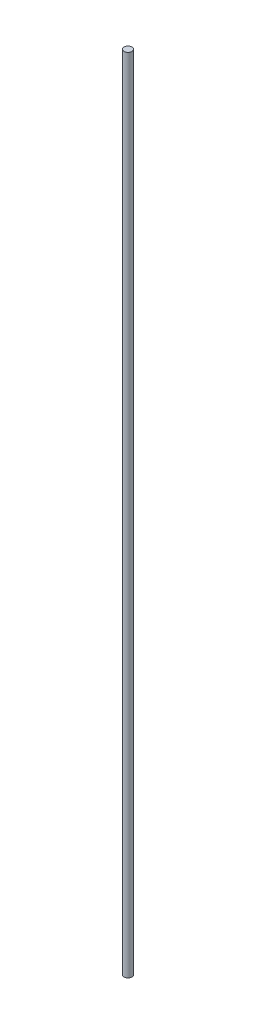
ISO-10303-21;
HEADER;
FILE_DESCRIPTION(('STEP AP214'),'2;1');
FILE_NAME('part.step','',(''),(''),'','','');
FILE_SCHEMA(('AUTOMOTIVE_DESIGN { 1 0 10303 214 1 1 1 1 }'));
ENDSEC;
DATA;
#1=APPLICATION_CONTEXT('core data for automotive mechanical design processes');
#2=APPLICATION_PROTOCOL_DEFINITION('international standard','automotive_design',2000,#1);
#3=PRODUCT_CONTEXT('',#1,'mechanical');
#4=PRODUCT('Part','Part','',(#3));
#5=PRODUCT_RELATED_PRODUCT_CATEGORY('part','',(#4));
#6=PRODUCT_DEFINITION_FORMATION('','',#4);
#7=PRODUCT_DEFINITION_CONTEXT('part definition',#1,'design');
#8=PRODUCT_DEFINITION('design','',#6,#7);
#9=PRODUCT_DEFINITION_SHAPE('','',#8);
#10=(LENGTH_UNIT() NAMED_UNIT(*) SI_UNIT(.MILLI.,.METRE.));
#11=(NAMED_UNIT(*) PLANE_ANGLE_UNIT() SI_UNIT($,.RADIAN.));
#12=(NAMED_UNIT(*) SI_UNIT($,.STERADIAN.) SOLID_ANGLE_UNIT());
#13=UNCERTAINTY_MEASURE_WITH_UNIT(LENGTH_MEASURE(1.E-05),#10,'distance_accuracy_value','');
#14=(GEOMETRIC_REPRESENTATION_CONTEXT(3) GLOBAL_UNCERTAINTY_ASSIGNED_CONTEXT((#13)) GLOBAL_UNIT_ASSIGNED_CONTEXT((#10,
#11,#12)) REPRESENTATION_CONTEXT('',''));
#15=CARTESIAN_POINT('',(0.,0.,0.));
#16=DIRECTION('',(0.,0.,1.));
#17=DIRECTION('',(1.,0.,0.));
#18=AXIS2_PLACEMENT_3D('',#15,#16,#17);
#19=CARTESIAN_POINT('',(0.,-400.,0.));
#20=DIRECTION('',(0.,1.,0.));
#21=DIRECTION('',(0.,0.,1.));
#22=AXIS2_PLACEMENT_3D('',#19,#20,#21);
#23=CYLINDRICAL_SURFACE('',#22,4.);
#24=CARTESIAN_POINT('',(0.,-400.,0.));
#25=DIRECTION('',(0.,1.,0.));
#26=DIRECTION('',(0.,0.,1.));
#27=AXIS2_PLACEMENT_3D('',#24,#25,#26);
#28=CIRCLE('',#27,4.);
#29=CARTESIAN_POINT('',(0.,-400.,4.));
#30=VERTEX_POINT('',#29);
#31=EDGE_CURVE('E10',#30,#30,#28,.T.);
#32=ORIENTED_EDGE('',*,*,#31,.T.);
#33=EDGE_LOOP('',(#32));
#34=FACE_BOUND('',#33,.T.);
#35=CARTESIAN_POINT('',(0.,420.,0.));
#36=DIRECTION('',(0.,1.,0.));
#37=DIRECTION('',(0.,0.,1.));
#38=AXIS2_PLACEMENT_3D('',#35,#36,#37);
#39=CIRCLE('',#38,4.);
#40=CARTESIAN_POINT('',(0.,420.,4.));
#41=VERTEX_POINT('',#40);
#42=EDGE_CURVE('E48',#41,#41,#39,.T.);
#43=ORIENTED_EDGE('',*,*,#42,.F.);
#44=EDGE_LOOP('',(#43));
#45=FACE_BOUND('',#44,.T.);
#46=ADVANCED_FACE('F41',(#34,#45),#23,.T.);
#47=CARTESIAN_POINT('',(0.,-400.,0.));
#48=DIRECTION('',(0.,1.,0.));
#49=DIRECTION('',(0.,0.,1.));
#50=AXIS2_PLACEMENT_3D('',#47,#48,#49);
#51=PLANE('',#50);
#52=ORIENTED_EDGE('',*,*,#31,.F.);
#53=EDGE_LOOP('',(#52));
#54=FACE_BOUND('',#53,.T.);
#55=ADVANCED_FACE('F58',(#54),#51,.F.);
#56=CARTESIAN_POINT('',(0.,420.,0.));
#57=DIRECTION('',(0.,1.,0.));
#58=DIRECTION('',(0.,0.,1.));
#59=AXIS2_PLACEMENT_3D('',#56,#57,#58);
#60=PLANE('',#59);
#61=ORIENTED_EDGE('',*,*,#42,.T.);
#62=EDGE_LOOP('',(#61));
#63=FACE_BOUND('',#62,.T.);
#64=ADVANCED_FACE('F55',(#63),#60,.T.);
#65=CLOSED_SHELL('',(#46,#55,#64));
#66=MANIFOLD_SOLID_BREP('B2',#65);
#67=ADVANCED_BREP_SHAPE_REPRESENTATION('',(#18,#66),#14);
#68=SHAPE_DEFINITION_REPRESENTATION(#9,#67);
ENDSEC;
END-ISO-10303-21;
